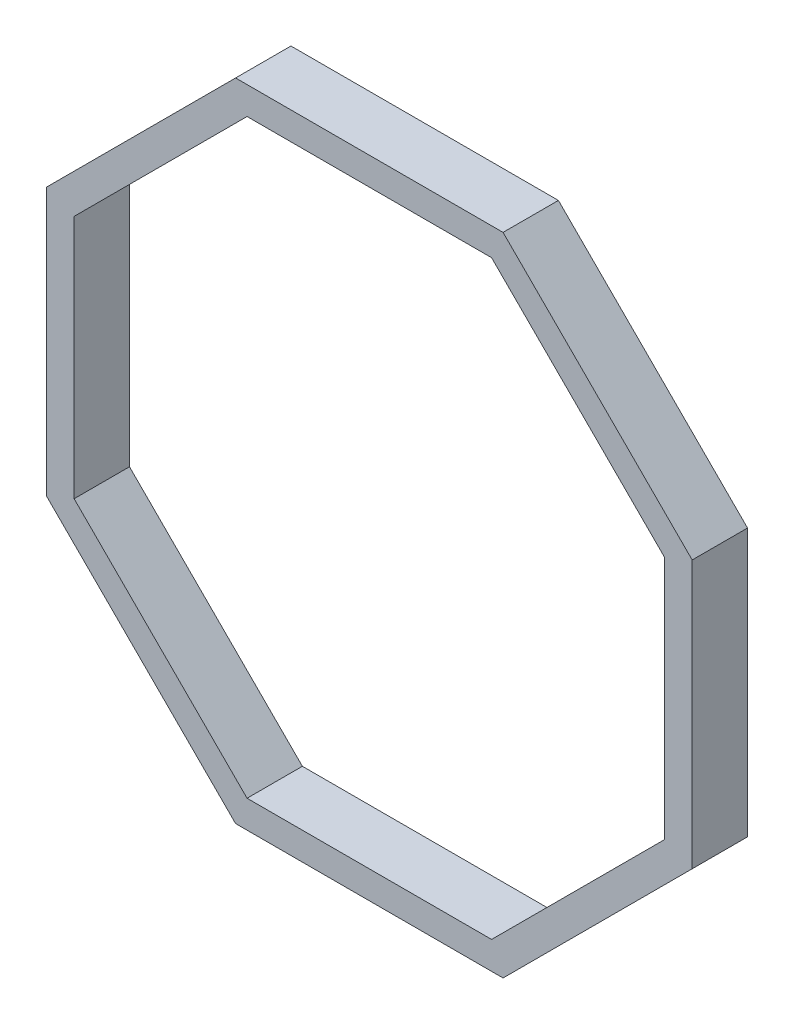
ISO-10303-21;
HEADER;
FILE_DESCRIPTION(('STEP AP214'),'2;1');
FILE_NAME('part.step','',(''),(''),'','','');
FILE_SCHEMA(('AUTOMOTIVE_DESIGN { 1 0 10303 214 1 1 1 1 }'));
ENDSEC;
DATA;
#1=APPLICATION_CONTEXT('core data for automotive mechanical design processes');
#2=APPLICATION_PROTOCOL_DEFINITION('international standard','automotive_design',2000,#1);
#3=PRODUCT_CONTEXT('',#1,'mechanical');
#4=PRODUCT('Part','Part','',(#3));
#5=PRODUCT_RELATED_PRODUCT_CATEGORY('part','',(#4));
#6=PRODUCT_DEFINITION_FORMATION('','',#4);
#7=PRODUCT_DEFINITION_CONTEXT('part definition',#1,'design');
#8=PRODUCT_DEFINITION('design','',#6,#7);
#9=PRODUCT_DEFINITION_SHAPE('','',#8);
#10=(LENGTH_UNIT() NAMED_UNIT(*) SI_UNIT(.MILLI.,.METRE.));
#11=(NAMED_UNIT(*) PLANE_ANGLE_UNIT() SI_UNIT($,.RADIAN.));
#12=(NAMED_UNIT(*) SI_UNIT($,.STERADIAN.) SOLID_ANGLE_UNIT());
#13=UNCERTAINTY_MEASURE_WITH_UNIT(LENGTH_MEASURE(1.E-05),#10,'distance_accuracy_value','');
#14=(GEOMETRIC_REPRESENTATION_CONTEXT(3) GLOBAL_UNCERTAINTY_ASSIGNED_CONTEXT((#13)) GLOBAL_UNIT_ASSIGNED_CONTEXT((#10,
#11,#12)) REPRESENTATION_CONTEXT('',''));
#15=CARTESIAN_POINT('',(0.,0.,0.));
#16=DIRECTION('',(0.,0.,1.));
#17=DIRECTION('',(1.,0.,0.));
#18=AXIS2_PLACEMENT_3D('',#15,#16,#17);
#19=CARTESIAN_POINT('',(0.,0.,30.));
#20=DIRECTION('',(0.,0.,1.));
#21=DIRECTION('',(1.,0.,0.));
#22=AXIS2_PLACEMENT_3D('',#19,#20,#21);
#23=PLANE('',#22);
#24=DIRECTION('',(0.,1.,0.));
#25=VECTOR('',#24,1.);
#26=CARTESIAN_POINT('',(175.,-72.4873734152912,30.));
#27=LINE('',#26,#25);
#28=CARTESIAN_POINT('',(175.,-72.4873734152912,30.));
#29=VERTEX_POINT('',#28);
#30=CARTESIAN_POINT('',(174.999999999999,72.4873734152917,30.));
#31=VERTEX_POINT('',#30);
#32=EDGE_CURVE('E211',#29,#31,#27,.T.);
#33=ORIENTED_EDGE('',*,*,#32,.T.);
#34=DIRECTION('',(-0.707106781186549,0.707106781186546,0.));
#35=VECTOR('',#34,1.);
#36=CARTESIAN_POINT('',(174.999999999999,72.4873734152917,30.));
#37=LINE('',#36,#35);
#38=CARTESIAN_POINT('',(72.4873734152911,175.,30.));
#39=VERTEX_POINT('',#38);
#40=EDGE_CURVE('E214',#31,#39,#37,.T.);
#41=ORIENTED_EDGE('',*,*,#40,.T.);
#42=DIRECTION('',(-1.,0.,0.));
#43=VECTOR('',#42,1.);
#44=CARTESIAN_POINT('',(72.4873734152911,175.,30.));
#45=LINE('',#44,#43);
#46=CARTESIAN_POINT('',(-72.4873734152918,174.999999999999,30.));
#47=VERTEX_POINT('',#46);
#48=EDGE_CURVE('E217',#39,#47,#45,.T.);
#49=ORIENTED_EDGE('',*,*,#48,.T.);
#50=DIRECTION('',(-0.707106781186546,-0.707106781186549,0.));
#51=VECTOR('',#50,1.);
#52=CARTESIAN_POINT('',(-72.4873734152918,174.999999999999,30.));
#53=LINE('',#52,#51);
#54=CARTESIAN_POINT('',(-175.,72.4873734152912,30.));
#55=VERTEX_POINT('',#54);
#56=EDGE_CURVE('E219',#47,#55,#53,.T.);
#57=ORIENTED_EDGE('',*,*,#56,.T.);
#58=DIRECTION('',(0.,-1.,0.));
#59=VECTOR('',#58,1.);
#60=CARTESIAN_POINT('',(-175.,72.4873734152912,30.));
#61=LINE('',#60,#59);
#62=CARTESIAN_POINT('',(-174.999999999999,-72.4873734152919,30.));
#63=VERTEX_POINT('',#62);
#64=EDGE_CURVE('E221',#55,#63,#61,.T.);
#65=ORIENTED_EDGE('',*,*,#64,.T.);
#66=DIRECTION('',(0.707106781186549,-0.707106781186546,0.));
#67=VECTOR('',#66,1.);
#68=CARTESIAN_POINT('',(-174.999999999999,-72.4873734152919,30.));
#69=LINE('',#68,#67);
#70=CARTESIAN_POINT('',(-72.4873734152912,-175.,30.));
#71=VERTEX_POINT('',#70);
#72=EDGE_CURVE('E223',#63,#71,#69,.T.);
#73=ORIENTED_EDGE('',*,*,#72,.T.);
#74=DIRECTION('',(1.,0.,0.));
#75=VECTOR('',#74,1.);
#76=CARTESIAN_POINT('',(-72.4873734152912,-175.,30.));
#77=LINE('',#76,#75);
#78=CARTESIAN_POINT('',(72.4873734152918,-175.,30.));
#79=VERTEX_POINT('',#78);
#80=EDGE_CURVE('E225',#71,#79,#77,.T.);
#81=ORIENTED_EDGE('',*,*,#80,.T.);
#82=DIRECTION('',(0.707106781186546,0.707106781186549,0.));
#83=VECTOR('',#82,1.);
#84=CARTESIAN_POINT('',(72.4873734152918,-175.,30.));
#85=LINE('',#84,#83);
#86=EDGE_CURVE('E227',#79,#29,#85,.T.);
#87=ORIENTED_EDGE('',*,*,#86,.T.);
#88=EDGE_LOOP('',(#33,#41,#49,#57,#65,#73,#81,#87));
#89=FACE_BOUND('',#88,.T.);
#90=DIRECTION('',(-0.707106781186548,0.707106781186547,0.));
#91=VECTOR('',#90,1.);
#92=CARTESIAN_POINT('',(160.,66.2741699796951,30.));
#93=LINE('',#92,#91);
#94=CARTESIAN_POINT('',(160.,66.2741699796951,30.));
#95=VERTEX_POINT('',#94);
#96=CARTESIAN_POINT('',(66.2741699796949,160.,30.));
#97=VERTEX_POINT('',#96);
#98=EDGE_CURVE('E154',#95,#97,#93,.T.);
#99=ORIENTED_EDGE('',*,*,#98,.F.);
#100=DIRECTION('',(0.,1.,0.));
#101=VECTOR('',#100,1.);
#102=CARTESIAN_POINT('',(160.,-66.2741699796949,30.));
#103=LINE('',#102,#101);
#104=CARTESIAN_POINT('',(160.,-66.2741699796949,30.));
#105=VERTEX_POINT('',#104);
#106=EDGE_CURVE('E146',#105,#95,#103,.T.);
#107=ORIENTED_EDGE('',*,*,#106,.F.);
#108=DIRECTION('',(0.707106781186547,0.707106781186548,0.));
#109=VECTOR('',#108,1.);
#110=CARTESIAN_POINT('',(66.2741699796951,-160.,30.));
#111=LINE('',#110,#109);
#112=CARTESIAN_POINT('',(66.2741699796951,-160.,30.));
#113=VERTEX_POINT('',#112);
#114=EDGE_CURVE('E179',#113,#105,#111,.T.);
#115=ORIENTED_EDGE('',*,*,#114,.F.);
#116=DIRECTION('',(1.,0.,0.));
#117=VECTOR('',#116,1.);
#118=CARTESIAN_POINT('',(-66.2741699796949,-160.,30.));
#119=LINE('',#118,#117);
#120=CARTESIAN_POINT('',(-66.2741699796949,-160.,30.));
#121=VERTEX_POINT('',#120);
#122=EDGE_CURVE('E177',#121,#113,#119,.T.);
#123=ORIENTED_EDGE('',*,*,#122,.F.);
#124=DIRECTION('',(0.707106781186548,-0.707106781186547,0.));
#125=VECTOR('',#124,1.);
#126=CARTESIAN_POINT('',(-160.,-66.2741699796952,30.));
#127=LINE('',#126,#125);
#128=CARTESIAN_POINT('',(-160.,-66.2741699796952,30.));
#129=VERTEX_POINT('',#128);
#130=EDGE_CURVE('E175',#129,#121,#127,.T.);
#131=ORIENTED_EDGE('',*,*,#130,.F.);
#132=DIRECTION('',(0.,-1.,0.));
#133=VECTOR('',#132,1.);
#134=CARTESIAN_POINT('',(-160.,66.274169979695,30.));
#135=LINE('',#134,#133);
#136=CARTESIAN_POINT('',(-160.,66.274169979695,30.));
#137=VERTEX_POINT('',#136);
#138=EDGE_CURVE('E173',#137,#129,#135,.T.);
#139=ORIENTED_EDGE('',*,*,#138,.F.);
#140=DIRECTION('',(-0.707106781186547,-0.707106781186548,0.));
#141=VECTOR('',#140,1.);
#142=CARTESIAN_POINT('',(-66.2741699796953,160.,30.));
#143=LINE('',#142,#141);
#144=CARTESIAN_POINT('',(-66.2741699796953,160.,30.));
#145=VERTEX_POINT('',#144);
#146=EDGE_CURVE('E169',#145,#137,#143,.T.);
#147=ORIENTED_EDGE('',*,*,#146,.F.);
#148=DIRECTION('',(-1.,0.,0.));
#149=VECTOR('',#148,1.);
#150=CARTESIAN_POINT('',(66.2741699796949,160.,30.));
#151=LINE('',#150,#149);
#152=EDGE_CURVE('E167',#97,#145,#151,.T.);
#153=ORIENTED_EDGE('',*,*,#152,.F.);
#154=EDGE_LOOP('',(#99,#107,#115,#123,#131,#139,#147,#153));
#155=FACE_BOUND('',#154,.T.);
#156=ADVANCED_FACE('F33',(#89,#155),#23,.T.);
#157=CARTESIAN_POINT('',(0.,0.,0.));
#158=DIRECTION('',(0.,0.,1.));
#159=DIRECTION('',(1.,0.,0.));
#160=AXIS2_PLACEMENT_3D('',#157,#158,#159);
#161=PLANE('',#160);
#162=DIRECTION('',(0.,1.,0.));
#163=VECTOR('',#162,1.);
#164=CARTESIAN_POINT('',(175.,-72.4873734152912,0.));
#165=LINE('',#164,#163);
#166=CARTESIAN_POINT('',(175.,-72.4873734152912,0.));
#167=VERTEX_POINT('',#166);
#168=CARTESIAN_POINT('',(174.999999999999,72.4873734152917,0.));
#169=VERTEX_POINT('',#168);
#170=EDGE_CURVE('E162',#167,#169,#165,.T.);
#171=ORIENTED_EDGE('',*,*,#170,.F.);
#172=DIRECTION('',(0.707106781186546,0.707106781186549,0.));
#173=VECTOR('',#172,1.);
#174=CARTESIAN_POINT('',(72.4873734152918,-175.,0.));
#175=LINE('',#174,#173);
#176=CARTESIAN_POINT('',(72.4873734152918,-175.,0.));
#177=VERTEX_POINT('',#176);
#178=EDGE_CURVE('E215',#177,#167,#175,.T.);
#179=ORIENTED_EDGE('',*,*,#178,.F.);
#180=DIRECTION('',(1.,0.,0.));
#181=VECTOR('',#180,1.);
#182=CARTESIAN_POINT('',(-72.4873734152912,-175.,0.));
#183=LINE('',#182,#181);
#184=CARTESIAN_POINT('',(-72.4873734152912,-175.,0.));
#185=VERTEX_POINT('',#184);
#186=EDGE_CURVE('E242',#185,#177,#183,.T.);
#187=ORIENTED_EDGE('',*,*,#186,.F.);
#188=DIRECTION('',(0.707106781186549,-0.707106781186546,0.));
#189=VECTOR('',#188,1.);
#190=CARTESIAN_POINT('',(-174.999999999999,-72.4873734152919,0.));
#191=LINE('',#190,#189);
#192=CARTESIAN_POINT('',(-174.999999999999,-72.4873734152919,0.));
#193=VERTEX_POINT('',#192);
#194=EDGE_CURVE('E240',#193,#185,#191,.T.);
#195=ORIENTED_EDGE('',*,*,#194,.F.);
#196=DIRECTION('',(0.,-1.,0.));
#197=VECTOR('',#196,1.);
#198=CARTESIAN_POINT('',(-175.,72.4873734152912,0.));
#199=LINE('',#198,#197);
#200=CARTESIAN_POINT('',(-175.,72.4873734152912,0.));
#201=VERTEX_POINT('',#200);
#202=EDGE_CURVE('E238',#201,#193,#199,.T.);
#203=ORIENTED_EDGE('',*,*,#202,.F.);
#204=DIRECTION('',(-0.707106781186546,-0.707106781186549,0.));
#205=VECTOR('',#204,1.);
#206=CARTESIAN_POINT('',(-72.4873734152918,174.999999999999,0.));
#207=LINE('',#206,#205);
#208=CARTESIAN_POINT('',(-72.4873734152918,174.999999999999,0.));
#209=VERTEX_POINT('',#208);
#210=EDGE_CURVE('E236',#209,#201,#207,.T.);
#211=ORIENTED_EDGE('',*,*,#210,.F.);
#212=DIRECTION('',(-1.,0.,0.));
#213=VECTOR('',#212,1.);
#214=CARTESIAN_POINT('',(72.4873734152911,175.,0.));
#215=LINE('',#214,#213);
#216=CARTESIAN_POINT('',(72.4873734152911,175.,0.));
#217=VERTEX_POINT('',#216);
#218=EDGE_CURVE('E234',#217,#209,#215,.T.);
#219=ORIENTED_EDGE('',*,*,#218,.F.);
#220=DIRECTION('',(-0.707106781186549,0.707106781186546,0.));
#221=VECTOR('',#220,1.);
#222=CARTESIAN_POINT('',(174.999999999999,72.4873734152917,0.));
#223=LINE('',#222,#221);
#224=EDGE_CURVE('E232',#169,#217,#223,.T.);
#225=ORIENTED_EDGE('',*,*,#224,.F.);
#226=EDGE_LOOP('',(#171,#179,#187,#195,#203,#211,#219,#225));
#227=FACE_BOUND('',#226,.T.);
#228=DIRECTION('',(0.,1.,0.));
#229=VECTOR('',#228,1.);
#230=CARTESIAN_POINT('',(160.,-66.2741699796949,0.));
#231=LINE('',#230,#229);
#232=CARTESIAN_POINT('',(160.,-66.2741699796949,0.));
#233=VERTEX_POINT('',#232);
#234=CARTESIAN_POINT('',(160.,66.2741699796951,0.));
#235=VERTEX_POINT('',#234);
#236=EDGE_CURVE('E56',#233,#235,#231,.T.);
#237=ORIENTED_EDGE('',*,*,#236,.T.);
#238=DIRECTION('',(-0.707106781186548,0.707106781186547,0.));
#239=VECTOR('',#238,1.);
#240=CARTESIAN_POINT('',(160.,66.2741699796951,0.));
#241=LINE('',#240,#239);
#242=CARTESIAN_POINT('',(66.2741699796949,160.,0.));
#243=VERTEX_POINT('',#242);
#244=EDGE_CURVE('E161',#235,#243,#241,.T.);
#245=ORIENTED_EDGE('',*,*,#244,.T.);
#246=DIRECTION('',(-1.,0.,0.));
#247=VECTOR('',#246,1.);
#248=CARTESIAN_POINT('',(66.2741699796949,160.,0.));
#249=LINE('',#248,#247);
#250=CARTESIAN_POINT('',(-66.2741699796953,160.,0.));
#251=VERTEX_POINT('',#250);
#252=EDGE_CURVE('E183',#243,#251,#249,.T.);
#253=ORIENTED_EDGE('',*,*,#252,.T.);
#254=DIRECTION('',(-0.707106781186547,-0.707106781186548,0.));
#255=VECTOR('',#254,1.);
#256=CARTESIAN_POINT('',(-66.2741699796953,160.,0.));
#257=LINE('',#256,#255);
#258=CARTESIAN_POINT('',(-160.,66.274169979695,0.));
#259=VERTEX_POINT('',#258);
#260=EDGE_CURVE('E186',#251,#259,#257,.T.);
#261=ORIENTED_EDGE('',*,*,#260,.T.);
#262=DIRECTION('',(0.,-1.,0.));
#263=VECTOR('',#262,1.);
#264=CARTESIAN_POINT('',(-160.,66.274169979695,0.));
#265=LINE('',#264,#263);
#266=CARTESIAN_POINT('',(-160.,-66.2741699796952,0.));
#267=VERTEX_POINT('',#266);
#268=EDGE_CURVE('E189',#259,#267,#265,.T.);
#269=ORIENTED_EDGE('',*,*,#268,.T.);
#270=DIRECTION('',(0.707106781186548,-0.707106781186547,0.));
#271=VECTOR('',#270,1.);
#272=CARTESIAN_POINT('',(-160.,-66.2741699796952,0.));
#273=LINE('',#272,#271);
#274=CARTESIAN_POINT('',(-66.2741699796949,-160.,0.));
#275=VERTEX_POINT('',#274);
#276=EDGE_CURVE('E192',#267,#275,#273,.T.);
#277=ORIENTED_EDGE('',*,*,#276,.T.);
#278=DIRECTION('',(1.,0.,0.));
#279=VECTOR('',#278,1.);
#280=CARTESIAN_POINT('',(-66.2741699796949,-160.,0.));
#281=LINE('',#280,#279);
#282=CARTESIAN_POINT('',(66.2741699796951,-160.,0.));
#283=VERTEX_POINT('',#282);
#284=EDGE_CURVE('E195',#275,#283,#281,.T.);
#285=ORIENTED_EDGE('',*,*,#284,.T.);
#286=DIRECTION('',(0.707106781186547,0.707106781186548,0.));
#287=VECTOR('',#286,1.);
#288=CARTESIAN_POINT('',(66.2741699796951,-160.,0.));
#289=LINE('',#288,#287);
#290=EDGE_CURVE('E155',#283,#233,#289,.T.);
#291=ORIENTED_EDGE('',*,*,#290,.T.);
#292=EDGE_LOOP('',(#237,#245,#253,#261,#269,#277,#285,#291));
#293=FACE_BOUND('',#292,.T.);
#294=ADVANCED_FACE('F272',(#227,#293),#161,.F.);
#295=CARTESIAN_POINT('',(175.,-72.4873734152912,30.));
#296=DIRECTION('',(-1.,0.,0.));
#297=DIRECTION('',(0.,-1.,0.));
#298=AXIS2_PLACEMENT_3D('',#295,#296,#297);
#299=PLANE('',#298);
#300=ORIENTED_EDGE('',*,*,#170,.T.);
#301=DIRECTION('',(0.,0.,-1.));
#302=VECTOR('',#301,1.);
#303=CARTESIAN_POINT('',(174.999999999999,72.4873734152917,30.));
#304=LINE('',#303,#302);
#305=EDGE_CURVE('E11',#31,#169,#304,.T.);
#306=ORIENTED_EDGE('',*,*,#305,.F.);
#307=ORIENTED_EDGE('',*,*,#32,.F.);
#308=DIRECTION('',(0.,0.,-1.));
#309=VECTOR('',#308,1.);
#310=CARTESIAN_POINT('',(175.,-72.4873734152912,30.));
#311=LINE('',#310,#309);
#312=EDGE_CURVE('E229',#29,#167,#311,.T.);
#313=ORIENTED_EDGE('',*,*,#312,.T.);
#314=EDGE_LOOP('',(#300,#306,#307,#313));
#315=FACE_BOUND('',#314,.T.);
#316=ADVANCED_FACE('F35',(#315),#299,.F.);
#317=CARTESIAN_POINT('',(174.999999999999,72.4873734152917,30.));
#318=DIRECTION('',(-0.707106781186546,-0.707106781186549,0.));
#319=DIRECTION('',(0.707106781186549,-0.707106781186546,0.));
#320=AXIS2_PLACEMENT_3D('',#317,#318,#319);
#321=PLANE('',#320);
#322=ORIENTED_EDGE('',*,*,#224,.T.);
#323=DIRECTION('',(0.,0.,-1.));
#324=VECTOR('',#323,1.);
#325=CARTESIAN_POINT('',(72.4873734152911,175.,30.));
#326=LINE('',#325,#324);
#327=EDGE_CURVE('E41',#39,#217,#326,.T.);
#328=ORIENTED_EDGE('',*,*,#327,.F.);
#329=ORIENTED_EDGE('',*,*,#40,.F.);
#330=ORIENTED_EDGE('',*,*,#305,.T.);
#331=EDGE_LOOP('',(#322,#328,#329,#330));
#332=FACE_BOUND('',#331,.T.);
#333=ADVANCED_FACE('F289',(#332),#321,.F.);
#334=CARTESIAN_POINT('',(72.4873734152911,175.,30.));
#335=DIRECTION('',(0.,-1.,0.));
#336=DIRECTION('',(1.,0.,0.));
#337=AXIS2_PLACEMENT_3D('',#334,#335,#336);
#338=PLANE('',#337);
#339=ORIENTED_EDGE('',*,*,#218,.T.);
#340=DIRECTION('',(0.,0.,-1.));
#341=VECTOR('',#340,1.);
#342=CARTESIAN_POINT('',(-72.4873734152918,174.999999999999,30.));
#343=LINE('',#342,#341);
#344=EDGE_CURVE('E259',#47,#209,#343,.T.);
#345=ORIENTED_EDGE('',*,*,#344,.F.);
#346=ORIENTED_EDGE('',*,*,#48,.F.);
#347=ORIENTED_EDGE('',*,*,#327,.T.);
#348=EDGE_LOOP('',(#339,#345,#346,#347));
#349=FACE_BOUND('',#348,.T.);
#350=ADVANCED_FACE('F266',(#349),#338,.F.);
#351=CARTESIAN_POINT('',(-72.4873734152918,174.999999999999,30.));
#352=DIRECTION('',(0.707106781186549,-0.707106781186546,0.));
#353=DIRECTION('',(0.707106781186546,0.707106781186549,0.));
#354=AXIS2_PLACEMENT_3D('',#351,#352,#353);
#355=PLANE('',#354);
#356=ORIENTED_EDGE('',*,*,#210,.T.);
#357=DIRECTION('',(0.,0.,-1.));
#358=VECTOR('',#357,1.);
#359=CARTESIAN_POINT('',(-175.,72.4873734152912,30.));
#360=LINE('',#359,#358);
#361=EDGE_CURVE('E256',#55,#201,#360,.T.);
#362=ORIENTED_EDGE('',*,*,#361,.F.);
#363=ORIENTED_EDGE('',*,*,#56,.F.);
#364=ORIENTED_EDGE('',*,*,#344,.T.);
#365=EDGE_LOOP('',(#356,#362,#363,#364));
#366=FACE_BOUND('',#365,.T.);
#367=ADVANCED_FACE('F278',(#366),#355,.F.);
#368=CARTESIAN_POINT('',(-175.,72.4873734152912,30.));
#369=DIRECTION('',(1.,0.,0.));
#370=DIRECTION('',(0.,1.,0.));
#371=AXIS2_PLACEMENT_3D('',#368,#369,#370);
#372=PLANE('',#371);
#373=ORIENTED_EDGE('',*,*,#202,.T.);
#374=DIRECTION('',(0.,0.,-1.));
#375=VECTOR('',#374,1.);
#376=CARTESIAN_POINT('',(-174.999999999999,-72.4873734152919,30.));
#377=LINE('',#376,#375);
#378=EDGE_CURVE('E253',#63,#193,#377,.T.);
#379=ORIENTED_EDGE('',*,*,#378,.F.);
#380=ORIENTED_EDGE('',*,*,#64,.F.);
#381=ORIENTED_EDGE('',*,*,#361,.T.);
#382=EDGE_LOOP('',(#373,#379,#380,#381));
#383=FACE_BOUND('',#382,.T.);
#384=ADVANCED_FACE('F282',(#383),#372,.F.);
#385=CARTESIAN_POINT('',(-174.999999999999,-72.4873734152919,30.));
#386=DIRECTION('',(0.707106781186546,0.707106781186549,0.));
#387=DIRECTION('',(-0.707106781186549,0.707106781186546,0.));
#388=AXIS2_PLACEMENT_3D('',#385,#386,#387);
#389=PLANE('',#388);
#390=ORIENTED_EDGE('',*,*,#194,.T.);
#391=DIRECTION('',(0.,0.,-1.));
#392=VECTOR('',#391,1.);
#393=CARTESIAN_POINT('',(-72.4873734152912,-175.,30.));
#394=LINE('',#393,#392);
#395=EDGE_CURVE('E250',#71,#185,#394,.T.);
#396=ORIENTED_EDGE('',*,*,#395,.F.);
#397=ORIENTED_EDGE('',*,*,#72,.F.);
#398=ORIENTED_EDGE('',*,*,#378,.T.);
#399=EDGE_LOOP('',(#390,#396,#397,#398));
#400=FACE_BOUND('',#399,.T.);
#401=ADVANCED_FACE('F302',(#400),#389,.F.);
#402=CARTESIAN_POINT('',(-72.4873734152912,-175.,30.));
#403=DIRECTION('',(0.,1.,0.));
#404=DIRECTION('',(-1.,0.,0.));
#405=AXIS2_PLACEMENT_3D('',#402,#403,#404);
#406=PLANE('',#405);
#407=ORIENTED_EDGE('',*,*,#186,.T.);
#408=DIRECTION('',(0.,0.,-1.));
#409=VECTOR('',#408,1.);
#410=CARTESIAN_POINT('',(72.4873734152918,-175.,30.));
#411=LINE('',#410,#409);
#412=EDGE_CURVE('E247',#79,#177,#411,.T.);
#413=ORIENTED_EDGE('',*,*,#412,.F.);
#414=ORIENTED_EDGE('',*,*,#80,.F.);
#415=ORIENTED_EDGE('',*,*,#395,.T.);
#416=EDGE_LOOP('',(#407,#413,#414,#415));
#417=FACE_BOUND('',#416,.T.);
#418=ADVANCED_FACE('F300',(#417),#406,.F.);
#419=CARTESIAN_POINT('',(72.4873734152918,-175.,30.));
#420=DIRECTION('',(-0.707106781186549,0.707106781186546,0.));
#421=DIRECTION('',(-0.707106781186546,-0.707106781186549,0.));
#422=AXIS2_PLACEMENT_3D('',#419,#420,#421);
#423=PLANE('',#422);
#424=ORIENTED_EDGE('',*,*,#178,.T.);
#425=ORIENTED_EDGE('',*,*,#312,.F.);
#426=ORIENTED_EDGE('',*,*,#86,.F.);
#427=ORIENTED_EDGE('',*,*,#412,.T.);
#428=EDGE_LOOP('',(#424,#425,#426,#427));
#429=FACE_BOUND('',#428,.T.);
#430=ADVANCED_FACE('F295',(#429),#423,.F.);
#431=CARTESIAN_POINT('',(160.,-66.2741699796949,30.));
#432=DIRECTION('',(-1.,0.,0.));
#433=DIRECTION('',(0.,-1.,0.));
#434=AXIS2_PLACEMENT_3D('',#431,#432,#433);
#435=PLANE('',#434);
#436=ORIENTED_EDGE('',*,*,#236,.F.);
#437=DIRECTION('',(0.,0.,-1.));
#438=VECTOR('',#437,1.);
#439=CARTESIAN_POINT('',(160.,-66.2741699796949,30.));
#440=LINE('',#439,#438);
#441=EDGE_CURVE('E150',#105,#233,#440,.T.);
#442=ORIENTED_EDGE('',*,*,#441,.F.);
#443=ORIENTED_EDGE('',*,*,#106,.T.);
#444=DIRECTION('',(0.,0.,-1.));
#445=VECTOR('',#444,1.);
#446=CARTESIAN_POINT('',(160.,66.2741699796951,30.));
#447=LINE('',#446,#445);
#448=EDGE_CURVE('E149',#95,#235,#447,.T.);
#449=ORIENTED_EDGE('',*,*,#448,.T.);
#450=EDGE_LOOP('',(#436,#442,#443,#449));
#451=FACE_BOUND('',#450,.T.);
#452=ADVANCED_FACE('F148',(#451),#435,.T.);
#453=CARTESIAN_POINT('',(160.,66.2741699796951,30.));
#454=DIRECTION('',(-0.707106781186547,-0.707106781186548,0.));
#455=DIRECTION('',(0.707106781186548,-0.707106781186547,0.));
#456=AXIS2_PLACEMENT_3D('',#453,#454,#455);
#457=PLANE('',#456);
#458=ORIENTED_EDGE('',*,*,#244,.F.);
#459=ORIENTED_EDGE('',*,*,#448,.F.);
#460=ORIENTED_EDGE('',*,*,#98,.T.);
#461=DIRECTION('',(0.,0.,-1.));
#462=VECTOR('',#461,1.);
#463=CARTESIAN_POINT('',(66.2741699796949,160.,30.));
#464=LINE('',#463,#462);
#465=EDGE_CURVE('E163',#97,#243,#464,.T.);
#466=ORIENTED_EDGE('',*,*,#465,.T.);
#467=EDGE_LOOP('',(#458,#459,#460,#466));
#468=FACE_BOUND('',#467,.T.);
#469=ADVANCED_FACE('F158',(#468),#457,.T.);
#470=CARTESIAN_POINT('',(66.2741699796949,160.,30.));
#471=DIRECTION('',(0.,-1.,0.));
#472=DIRECTION('',(1.,0.,0.));
#473=AXIS2_PLACEMENT_3D('',#470,#471,#472);
#474=PLANE('',#473);
#475=ORIENTED_EDGE('',*,*,#252,.F.);
#476=ORIENTED_EDGE('',*,*,#465,.F.);
#477=ORIENTED_EDGE('',*,*,#152,.T.);
#478=DIRECTION('',(0.,0.,-1.));
#479=VECTOR('',#478,1.);
#480=CARTESIAN_POINT('',(-66.2741699796953,160.,30.));
#481=LINE('',#480,#479);
#482=EDGE_CURVE('E208',#145,#251,#481,.T.);
#483=ORIENTED_EDGE('',*,*,#482,.T.);
#484=EDGE_LOOP('',(#475,#476,#477,#483));
#485=FACE_BOUND('',#484,.T.);
#486=ADVANCED_FACE('F327',(#485),#474,.T.);
#487=CARTESIAN_POINT('',(-66.2741699796953,160.,30.));
#488=DIRECTION('',(0.707106781186548,-0.707106781186547,0.));
#489=DIRECTION('',(0.707106781186547,0.707106781186548,0.));
#490=AXIS2_PLACEMENT_3D('',#487,#488,#489);
#491=PLANE('',#490);
#492=ORIENTED_EDGE('',*,*,#260,.F.);
#493=ORIENTED_EDGE('',*,*,#482,.F.);
#494=ORIENTED_EDGE('',*,*,#146,.T.);
#495=DIRECTION('',(0.,0.,-1.));
#496=VECTOR('',#495,1.);
#497=CARTESIAN_POINT('',(-160.,66.274169979695,30.));
#498=LINE('',#497,#496);
#499=EDGE_CURVE('E206',#137,#259,#498,.T.);
#500=ORIENTED_EDGE('',*,*,#499,.T.);
#501=EDGE_LOOP('',(#492,#493,#494,#500));
#502=FACE_BOUND('',#501,.T.);
#503=ADVANCED_FACE('F331',(#502),#491,.T.);
#504=CARTESIAN_POINT('',(-160.,66.274169979695,30.));
#505=DIRECTION('',(1.,0.,0.));
#506=DIRECTION('',(0.,1.,0.));
#507=AXIS2_PLACEMENT_3D('',#504,#505,#506);
#508=PLANE('',#507);
#509=ORIENTED_EDGE('',*,*,#268,.F.);
#510=ORIENTED_EDGE('',*,*,#499,.F.);
#511=ORIENTED_EDGE('',*,*,#138,.T.);
#512=DIRECTION('',(0.,0.,-1.));
#513=VECTOR('',#512,1.);
#514=CARTESIAN_POINT('',(-160.,-66.2741699796952,30.));
#515=LINE('',#514,#513);
#516=EDGE_CURVE('E204',#129,#267,#515,.T.);
#517=ORIENTED_EDGE('',*,*,#516,.T.);
#518=EDGE_LOOP('',(#509,#510,#511,#517));
#519=FACE_BOUND('',#518,.T.);
#520=ADVANCED_FACE('F337',(#519),#508,.T.);
#521=CARTESIAN_POINT('',(-160.,-66.2741699796952,30.));
#522=DIRECTION('',(0.707106781186547,0.707106781186548,0.));
#523=DIRECTION('',(-0.707106781186548,0.707106781186547,0.));
#524=AXIS2_PLACEMENT_3D('',#521,#522,#523);
#525=PLANE('',#524);
#526=ORIENTED_EDGE('',*,*,#276,.F.);
#527=ORIENTED_EDGE('',*,*,#516,.F.);
#528=ORIENTED_EDGE('',*,*,#130,.T.);
#529=DIRECTION('',(0.,0.,-1.));
#530=VECTOR('',#529,1.);
#531=CARTESIAN_POINT('',(-66.2741699796949,-160.,30.));
#532=LINE('',#531,#530);
#533=EDGE_CURVE('E202',#121,#275,#532,.T.);
#534=ORIENTED_EDGE('',*,*,#533,.T.);
#535=EDGE_LOOP('',(#526,#527,#528,#534));
#536=FACE_BOUND('',#535,.T.);
#537=ADVANCED_FACE('F341',(#536),#525,.T.);
#538=CARTESIAN_POINT('',(-66.2741699796949,-160.,30.));
#539=DIRECTION('',(0.,1.,0.));
#540=DIRECTION('',(-1.,0.,0.));
#541=AXIS2_PLACEMENT_3D('',#538,#539,#540);
#542=PLANE('',#541);
#543=ORIENTED_EDGE('',*,*,#284,.F.);
#544=ORIENTED_EDGE('',*,*,#533,.F.);
#545=ORIENTED_EDGE('',*,*,#122,.T.);
#546=DIRECTION('',(0.,0.,-1.));
#547=VECTOR('',#546,1.);
#548=CARTESIAN_POINT('',(66.2741699796951,-160.,30.));
#549=LINE('',#548,#547);
#550=EDGE_CURVE('E48',#113,#283,#549,.T.);
#551=ORIENTED_EDGE('',*,*,#550,.T.);
#552=EDGE_LOOP('',(#543,#544,#545,#551));
#553=FACE_BOUND('',#552,.T.);
#554=ADVANCED_FACE('F345',(#553),#542,.T.);
#555=CARTESIAN_POINT('',(66.2741699796951,-160.,30.));
#556=DIRECTION('',(-0.707106781186548,0.707106781186547,0.));
#557=DIRECTION('',(-0.707106781186547,-0.707106781186548,0.));
#558=AXIS2_PLACEMENT_3D('',#555,#556,#557);
#559=PLANE('',#558);
#560=ORIENTED_EDGE('',*,*,#290,.F.);
#561=ORIENTED_EDGE('',*,*,#550,.F.);
#562=ORIENTED_EDGE('',*,*,#114,.T.);
#563=ORIENTED_EDGE('',*,*,#441,.T.);
#564=EDGE_LOOP('',(#560,#561,#562,#563));
#565=FACE_BOUND('',#564,.T.);
#566=ADVANCED_FACE('F349',(#565),#559,.T.);
#567=CLOSED_SHELL('',(#156,#294,#316,#333,#350,#367,#384,#401,#418,#430,#452,#469,#486,#503,
#520,#537,#554,#566));
#568=MANIFOLD_SOLID_BREP('B2',#567);
#569=ADVANCED_BREP_SHAPE_REPRESENTATION('',(#18,#568),#14);
#570=SHAPE_DEFINITION_REPRESENTATION(#9,#569);
ENDSEC;
END-ISO-10303-21;
